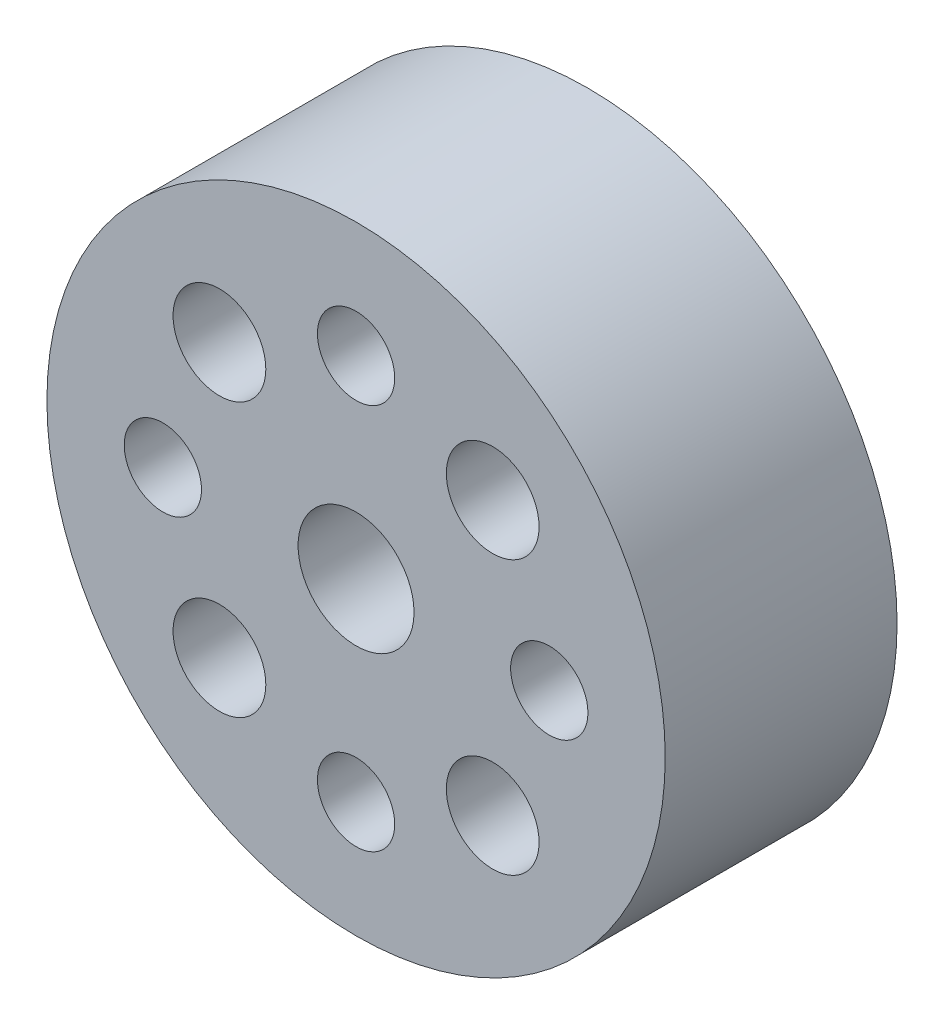
ISO-10303-21;
HEADER;
FILE_DESCRIPTION(('STEP AP214'),'2;1');
FILE_NAME('part.step','',(''),(''),'','','');
FILE_SCHEMA(('AUTOMOTIVE_DESIGN { 1 0 10303 214 1 1 1 1 }'));
ENDSEC;
DATA;
#1=APPLICATION_CONTEXT('core data for automotive mechanical design processes');
#2=APPLICATION_PROTOCOL_DEFINITION('international standard','automotive_design',2000,#1);
#3=PRODUCT_CONTEXT('',#1,'mechanical');
#4=PRODUCT('Part','Part','',(#3));
#5=PRODUCT_RELATED_PRODUCT_CATEGORY('part','',(#4));
#6=PRODUCT_DEFINITION_FORMATION('','',#4);
#7=PRODUCT_DEFINITION_CONTEXT('part definition',#1,'design');
#8=PRODUCT_DEFINITION('design','',#6,#7);
#9=PRODUCT_DEFINITION_SHAPE('','',#8);
#10=(LENGTH_UNIT() NAMED_UNIT(*) SI_UNIT(.MILLI.,.METRE.));
#11=(NAMED_UNIT(*) PLANE_ANGLE_UNIT() SI_UNIT($,.RADIAN.));
#12=(NAMED_UNIT(*) SI_UNIT($,.STERADIAN.) SOLID_ANGLE_UNIT());
#13=UNCERTAINTY_MEASURE_WITH_UNIT(LENGTH_MEASURE(1.E-05),#10,'distance_accuracy_value','');
#14=(GEOMETRIC_REPRESENTATION_CONTEXT(3) GLOBAL_UNCERTAINTY_ASSIGNED_CONTEXT((#13)) GLOBAL_UNIT_ASSIGNED_CONTEXT((#10,
#11,#12)) REPRESENTATION_CONTEXT('',''));
#15=CARTESIAN_POINT('',(0.,0.,0.));
#16=DIRECTION('',(0.,0.,1.));
#17=DIRECTION('',(1.,0.,0.));
#18=AXIS2_PLACEMENT_3D('',#15,#16,#17);
#19=CARTESIAN_POINT('',(0.,0.,30.));
#20=DIRECTION('',(0.,0.,-1.));
#21=DIRECTION('',(-1.,0.,0.));
#22=AXIS2_PLACEMENT_3D('',#19,#20,#21);
#23=CYLINDRICAL_SURFACE('',#22,40.);
#24=CARTESIAN_POINT('',(0.,0.,30.));
#25=DIRECTION('',(0.,0.,1.));
#26=DIRECTION('',(1.,0.,0.));
#27=AXIS2_PLACEMENT_3D('',#24,#25,#26);
#28=CIRCLE('',#27,40.);
#29=CARTESIAN_POINT('',(40.,0.,30.));
#30=VERTEX_POINT('',#29);
#31=EDGE_CURVE('E10',#30,#30,#28,.T.);
#32=ORIENTED_EDGE('',*,*,#31,.F.);
#33=EDGE_LOOP('',(#32));
#34=FACE_BOUND('',#33,.T.);
#35=CARTESIAN_POINT('',(0.,0.,0.));
#36=DIRECTION('',(0.,0.,1.));
#37=DIRECTION('',(1.,0.,0.));
#38=AXIS2_PLACEMENT_3D('',#35,#36,#37);
#39=CIRCLE('',#38,40.);
#40=CARTESIAN_POINT('',(40.,0.,0.));
#41=VERTEX_POINT('',#40);
#42=EDGE_CURVE('E34',#41,#41,#39,.T.);
#43=ORIENTED_EDGE('',*,*,#42,.T.);
#44=EDGE_LOOP('',(#43));
#45=FACE_BOUND('',#44,.T.);
#46=ADVANCED_FACE('F31',(#34,#45),#23,.T.);
#47=CARTESIAN_POINT('',(0.,0.,30.));
#48=DIRECTION('',(0.,0.,1.));
#49=DIRECTION('',(1.,0.,0.));
#50=AXIS2_PLACEMENT_3D('',#47,#48,#49);
#51=PLANE('',#50);
#52=CARTESIAN_POINT('',(0.,0.,30.));
#53=DIRECTION('',(0.,0.,1.));
#54=DIRECTION('',(1.,0.,0.));
#55=AXIS2_PLACEMENT_3D('',#52,#53,#54);
#56=CIRCLE('',#55,7.5);
#57=CARTESIAN_POINT('',(7.5,0.,30.));
#58=VERTEX_POINT('',#57);
#59=EDGE_CURVE('E91',#58,#58,#56,.T.);
#60=ORIENTED_EDGE('',*,*,#59,.F.);
#61=EDGE_LOOP('',(#60));
#62=FACE_BOUND('',#61,.T.);
#63=CARTESIAN_POINT('',(-17.6776695296637,17.6776695296617,30.));
#64=DIRECTION('',(0.,0.,1.));
#65=DIRECTION('',(1.,0.,0.));
#66=AXIS2_PLACEMENT_3D('',#63,#64,#65);
#67=CIRCLE('',#66,6.00000000000201);
#68=CARTESIAN_POINT('',(-11.6776695296617,17.6776695296617,30.));
#69=VERTEX_POINT('',#68);
#70=EDGE_CURVE('E73',#69,#69,#67,.T.);
#71=ORIENTED_EDGE('',*,*,#70,.F.);
#72=EDGE_LOOP('',(#71));
#73=FACE_BOUND('',#72,.T.);
#74=CARTESIAN_POINT('',(-17.6776695296617,-17.6776695296657,30.));
#75=DIRECTION('',(0.,0.,1.));
#76=DIRECTION('',(1.,0.,0.));
#77=AXIS2_PLACEMENT_3D('',#74,#75,#76);
#78=CIRCLE('',#77,6.0000000000014);
#79=CARTESIAN_POINT('',(-11.6776695296603,-17.6776695296657,30.));
#80=VERTEX_POINT('',#79);
#81=EDGE_CURVE('E80',#80,#80,#78,.T.);
#82=ORIENTED_EDGE('',*,*,#81,.F.);
#83=EDGE_LOOP('',(#82));
#84=FACE_BOUND('',#83,.T.);
#85=CARTESIAN_POINT('',(17.6776695296657,-17.6776695296636,30.));
#86=DIRECTION('',(0.,0.,1.));
#87=DIRECTION('',(1.,0.,0.));
#88=AXIS2_PLACEMENT_3D('',#85,#86,#87);
#89=CIRCLE('',#88,5.99999999999947);
#90=CARTESIAN_POINT('',(23.6776695296652,-17.6776695296636,30.));
#91=VERTEX_POINT('',#90);
#92=EDGE_CURVE('E86',#91,#91,#89,.T.);
#93=ORIENTED_EDGE('',*,*,#92,.F.);
#94=EDGE_LOOP('',(#93));
#95=FACE_BOUND('',#94,.T.);
#96=CARTESIAN_POINT('',(17.6776695296637,17.6776695296637,30.));
#97=DIRECTION('',(0.,0.,1.));
#98=DIRECTION('',(1.,0.,0.));
#99=AXIS2_PLACEMENT_3D('',#96,#97,#98);
#100=CIRCLE('',#99,6.);
#101=CARTESIAN_POINT('',(23.6776695296637,17.6776695296637,30.));
#102=VERTEX_POINT('',#101);
#103=EDGE_CURVE('E67',#102,#102,#100,.T.);
#104=ORIENTED_EDGE('',*,*,#103,.F.);
#105=EDGE_LOOP('',(#104));
#106=FACE_BOUND('',#105,.T.);
#107=CARTESIAN_POINT('',(25.,0.,30.));
#108=DIRECTION('',(0.,0.,1.));
#109=DIRECTION('',(1.,0.,0.));
#110=AXIS2_PLACEMENT_3D('',#107,#108,#109);
#111=CIRCLE('',#110,5.);
#112=CARTESIAN_POINT('',(30.,0.,30.));
#113=VERTEX_POINT('',#112);
#114=EDGE_CURVE('E62',#113,#113,#111,.T.);
#115=ORIENTED_EDGE('',*,*,#114,.F.);
#116=EDGE_LOOP('',(#115));
#117=FACE_BOUND('',#116,.T.);
#118=CARTESIAN_POINT('',(0.,-25.,30.));
#119=DIRECTION('',(0.,0.,1.));
#120=DIRECTION('',(1.,0.,0.));
#121=AXIS2_PLACEMENT_3D('',#118,#119,#120);
#122=CIRCLE('',#121,5.);
#123=CARTESIAN_POINT('',(4.99999999999991,-25.,30.));
#124=VERTEX_POINT('',#123);
#125=EDGE_CURVE('E56',#124,#124,#122,.T.);
#126=ORIENTED_EDGE('',*,*,#125,.F.);
#127=EDGE_LOOP('',(#126));
#128=FACE_BOUND('',#127,.T.);
#129=CARTESIAN_POINT('',(-25.,1.74574066942157E-13,30.));
#130=DIRECTION('',(0.,0.,1.));
#131=DIRECTION('',(1.,0.,0.));
#132=AXIS2_PLACEMENT_3D('',#129,#130,#131);
#133=CIRCLE('',#132,5.);
#134=CARTESIAN_POINT('',(-20.,1.74574066942157E-13,30.));
#135=VERTEX_POINT('',#134);
#136=EDGE_CURVE('E50',#135,#135,#133,.T.);
#137=ORIENTED_EDGE('',*,*,#136,.F.);
#138=EDGE_LOOP('',(#137));
#139=FACE_BOUND('',#138,.T.);
#140=CARTESIAN_POINT('',(2.61861100413235E-13,25.,30.));
#141=DIRECTION('',(0.,0.,1.));
#142=DIRECTION('',(1.,0.,0.));
#143=AXIS2_PLACEMENT_3D('',#140,#141,#142);
#144=CIRCLE('',#143,5.);
#145=CARTESIAN_POINT('',(5.00000000000026,25.,30.));
#146=VERTEX_POINT('',#145);
#147=EDGE_CURVE('E43',#146,#146,#144,.T.);
#148=ORIENTED_EDGE('',*,*,#147,.F.);
#149=EDGE_LOOP('',(#148));
#150=FACE_BOUND('',#149,.T.);
#151=ORIENTED_EDGE('',*,*,#31,.T.);
#152=EDGE_LOOP('',(#151));
#153=FACE_BOUND('',#152,.T.);
#154=ADVANCED_FACE('F106',(#62,#73,#84,#95,#106,#117,#128,#139,#150,#153),#51,.T.);
#155=CARTESIAN_POINT('',(0.,0.,0.));
#156=DIRECTION('',(0.,0.,1.));
#157=DIRECTION('',(1.,0.,0.));
#158=AXIS2_PLACEMENT_3D('',#155,#156,#157);
#159=PLANE('',#158);
#160=ORIENTED_EDGE('',*,*,#42,.F.);
#161=EDGE_LOOP('',(#160));
#162=FACE_BOUND('',#161,.T.);
#163=ADVANCED_FACE('F109',(#162),#159,.F.);
#164=CARTESIAN_POINT('',(2.61861100413235E-13,25.,5.));
#165=DIRECTION('',(0.,0.,1.));
#166=DIRECTION('',(1.,0.,0.));
#167=AXIS2_PLACEMENT_3D('',#164,#165,#166);
#168=CYLINDRICAL_SURFACE('',#167,5.);
#169=CARTESIAN_POINT('',(2.61861100413235E-13,25.,5.));
#170=DIRECTION('',(0.,0.,1.));
#171=DIRECTION('',(1.,0.,0.));
#172=AXIS2_PLACEMENT_3D('',#169,#170,#171);
#173=CIRCLE('',#172,5.);
#174=CARTESIAN_POINT('',(5.00000000000026,25.,5.));
#175=VERTEX_POINT('',#174);
#176=EDGE_CURVE('E46',#175,#175,#173,.T.);
#177=ORIENTED_EDGE('',*,*,#176,.F.);
#178=EDGE_LOOP('',(#177));
#179=FACE_BOUND('',#178,.T.);
#180=ORIENTED_EDGE('',*,*,#147,.T.);
#181=EDGE_LOOP('',(#180));
#182=FACE_BOUND('',#181,.T.);
#183=ADVANCED_FACE('F127',(#179,#182),#168,.F.);
#184=CARTESIAN_POINT('',(2.61861100413235E-13,25.,5.));
#185=DIRECTION('',(0.,0.,1.));
#186=DIRECTION('',(1.,0.,0.));
#187=AXIS2_PLACEMENT_3D('',#184,#185,#186);
#188=PLANE('',#187);
#189=ORIENTED_EDGE('',*,*,#176,.T.);
#190=EDGE_LOOP('',(#189));
#191=FACE_BOUND('',#190,.T.);
#192=ADVANCED_FACE('F129',(#191),#188,.T.);
#193=CARTESIAN_POINT('',(-25.,1.74574066942157E-13,5.));
#194=DIRECTION('',(0.,0.,1.));
#195=DIRECTION('',(1.,0.,0.));
#196=AXIS2_PLACEMENT_3D('',#193,#194,#195);
#197=CYLINDRICAL_SURFACE('',#196,5.);
#198=CARTESIAN_POINT('',(-25.,1.74574066942157E-13,5.));
#199=DIRECTION('',(0.,0.,1.));
#200=DIRECTION('',(1.,0.,0.));
#201=AXIS2_PLACEMENT_3D('',#198,#199,#200);
#202=CIRCLE('',#201,5.);
#203=CARTESIAN_POINT('',(-20.,1.74574066942157E-13,5.));
#204=VERTEX_POINT('',#203);
#205=EDGE_CURVE('E53',#204,#204,#202,.T.);
#206=ORIENTED_EDGE('',*,*,#205,.F.);
#207=EDGE_LOOP('',(#206));
#208=FACE_BOUND('',#207,.T.);
#209=ORIENTED_EDGE('',*,*,#136,.T.);
#210=EDGE_LOOP('',(#209));
#211=FACE_BOUND('',#210,.T.);
#212=ADVANCED_FACE('F136',(#208,#211),#197,.F.);
#213=CARTESIAN_POINT('',(-25.,1.74574066942157E-13,5.));
#214=DIRECTION('',(0.,0.,1.));
#215=DIRECTION('',(1.,0.,0.));
#216=AXIS2_PLACEMENT_3D('',#213,#214,#215);
#217=PLANE('',#216);
#218=ORIENTED_EDGE('',*,*,#205,.T.);
#219=EDGE_LOOP('',(#218));
#220=FACE_BOUND('',#219,.T.);
#221=ADVANCED_FACE('F176',(#220),#217,.T.);
#222=CARTESIAN_POINT('',(0.,-25.,5.));
#223=DIRECTION('',(0.,0.,1.));
#224=DIRECTION('',(1.,0.,0.));
#225=AXIS2_PLACEMENT_3D('',#222,#223,#224);
#226=CYLINDRICAL_SURFACE('',#225,5.);
#227=CARTESIAN_POINT('',(0.,-25.,5.));
#228=DIRECTION('',(0.,0.,1.));
#229=DIRECTION('',(1.,0.,0.));
#230=AXIS2_PLACEMENT_3D('',#227,#228,#229);
#231=CIRCLE('',#230,5.);
#232=CARTESIAN_POINT('',(4.99999999999991,-25.,5.));
#233=VERTEX_POINT('',#232);
#234=EDGE_CURVE('E59',#233,#233,#231,.T.);
#235=ORIENTED_EDGE('',*,*,#234,.F.);
#236=EDGE_LOOP('',(#235));
#237=FACE_BOUND('',#236,.T.);
#238=ORIENTED_EDGE('',*,*,#125,.T.);
#239=EDGE_LOOP('',(#238));
#240=FACE_BOUND('',#239,.T.);
#241=ADVANCED_FACE('F186',(#237,#240),#226,.F.);
#242=CARTESIAN_POINT('',(0.,-25.,5.));
#243=DIRECTION('',(0.,0.,1.));
#244=DIRECTION('',(1.,0.,0.));
#245=AXIS2_PLACEMENT_3D('',#242,#243,#244);
#246=PLANE('',#245);
#247=ORIENTED_EDGE('',*,*,#234,.T.);
#248=EDGE_LOOP('',(#247));
#249=FACE_BOUND('',#248,.T.);
#250=ADVANCED_FACE('F196',(#249),#246,.T.);
#251=CARTESIAN_POINT('',(25.,0.,5.));
#252=DIRECTION('',(0.,0.,1.));
#253=DIRECTION('',(1.,0.,0.));
#254=AXIS2_PLACEMENT_3D('',#251,#252,#253);
#255=CYLINDRICAL_SURFACE('',#254,5.);
#256=CARTESIAN_POINT('',(25.,0.,5.));
#257=DIRECTION('',(0.,0.,1.));
#258=DIRECTION('',(1.,0.,0.));
#259=AXIS2_PLACEMENT_3D('',#256,#257,#258);
#260=CIRCLE('',#259,5.);
#261=CARTESIAN_POINT('',(30.,0.,5.));
#262=VERTEX_POINT('',#261);
#263=EDGE_CURVE('E41',#262,#262,#260,.T.);
#264=ORIENTED_EDGE('',*,*,#263,.F.);
#265=EDGE_LOOP('',(#264));
#266=FACE_BOUND('',#265,.T.);
#267=ORIENTED_EDGE('',*,*,#114,.T.);
#268=EDGE_LOOP('',(#267));
#269=FACE_BOUND('',#268,.T.);
#270=ADVANCED_FACE('F206',(#266,#269),#255,.F.);
#271=CARTESIAN_POINT('',(25.,0.,5.));
#272=DIRECTION('',(0.,0.,1.));
#273=DIRECTION('',(1.,0.,0.));
#274=AXIS2_PLACEMENT_3D('',#271,#272,#273);
#275=PLANE('',#274);
#276=ORIENTED_EDGE('',*,*,#263,.T.);
#277=EDGE_LOOP('',(#276));
#278=FACE_BOUND('',#277,.T.);
#279=ADVANCED_FACE('F216',(#278),#275,.T.);
#280=CARTESIAN_POINT('',(17.6776695296637,17.6776695296637,5.));
#281=DIRECTION('',(0.,0.,1.));
#282=DIRECTION('',(1.,0.,0.));
#283=AXIS2_PLACEMENT_3D('',#280,#281,#282);
#284=CYLINDRICAL_SURFACE('',#283,6.);
#285=CARTESIAN_POINT('',(17.6776695296637,17.6776695296637,5.));
#286=DIRECTION('',(0.,0.,1.));
#287=DIRECTION('',(1.,0.,0.));
#288=AXIS2_PLACEMENT_3D('',#285,#286,#287);
#289=CIRCLE('',#288,6.);
#290=CARTESIAN_POINT('',(23.6776695296637,17.6776695296637,5.));
#291=VERTEX_POINT('',#290);
#292=EDGE_CURVE('E47',#291,#291,#289,.T.);
#293=ORIENTED_EDGE('',*,*,#292,.F.);
#294=EDGE_LOOP('',(#293));
#295=FACE_BOUND('',#294,.T.);
#296=ORIENTED_EDGE('',*,*,#103,.T.);
#297=EDGE_LOOP('',(#296));
#298=FACE_BOUND('',#297,.T.);
#299=ADVANCED_FACE('F226',(#295,#298),#284,.F.);
#300=CARTESIAN_POINT('',(17.6776695296637,17.6776695296637,5.));
#301=DIRECTION('',(0.,0.,1.));
#302=DIRECTION('',(1.,0.,0.));
#303=AXIS2_PLACEMENT_3D('',#300,#301,#302);
#304=PLANE('',#303);
#305=ORIENTED_EDGE('',*,*,#292,.T.);
#306=EDGE_LOOP('',(#305));
#307=FACE_BOUND('',#306,.T.);
#308=ADVANCED_FACE('F236',(#307),#304,.T.);
#309=CARTESIAN_POINT('',(17.6776695296657,-17.6776695296636,5.));
#310=DIRECTION('',(0.,0.,1.));
#311=DIRECTION('',(1.,0.,0.));
#312=AXIS2_PLACEMENT_3D('',#309,#310,#311);
#313=CYLINDRICAL_SURFACE('',#312,5.99999999999947);
#314=CARTESIAN_POINT('',(17.6776695296657,-17.6776695296636,5.));
#315=DIRECTION('',(0.,0.,1.));
#316=DIRECTION('',(1.,0.,0.));
#317=AXIS2_PLACEMENT_3D('',#314,#315,#316);
#318=CIRCLE('',#317,5.99999999999947);
#319=CARTESIAN_POINT('',(23.6776695296652,-17.6776695296636,5.));
#320=VERTEX_POINT('',#319);
#321=EDGE_CURVE('E70',#320,#320,#318,.T.);
#322=ORIENTED_EDGE('',*,*,#321,.F.);
#323=EDGE_LOOP('',(#322));
#324=FACE_BOUND('',#323,.T.);
#325=ORIENTED_EDGE('',*,*,#92,.T.);
#326=EDGE_LOOP('',(#325));
#327=FACE_BOUND('',#326,.T.);
#328=ADVANCED_FACE('F246',(#324,#327),#313,.F.);
#329=CARTESIAN_POINT('',(17.6776695296657,-17.6776695296636,5.));
#330=DIRECTION('',(0.,0.,1.));
#331=DIRECTION('',(1.,0.,0.));
#332=AXIS2_PLACEMENT_3D('',#329,#330,#331);
#333=PLANE('',#332);
#334=ORIENTED_EDGE('',*,*,#321,.T.);
#335=EDGE_LOOP('',(#334));
#336=FACE_BOUND('',#335,.T.);
#337=ADVANCED_FACE('F256',(#336),#333,.T.);
#338=CARTESIAN_POINT('',(-17.6776695296617,-17.6776695296657,5.));
#339=DIRECTION('',(0.,0.,1.));
#340=DIRECTION('',(1.,0.,0.));
#341=AXIS2_PLACEMENT_3D('',#338,#339,#340);
#342=CYLINDRICAL_SURFACE('',#341,6.0000000000014);
#343=CARTESIAN_POINT('',(-17.6776695296617,-17.6776695296657,5.));
#344=DIRECTION('',(0.,0.,1.));
#345=DIRECTION('',(1.,0.,0.));
#346=AXIS2_PLACEMENT_3D('',#343,#344,#345);
#347=CIRCLE('',#346,6.0000000000014);
#348=CARTESIAN_POINT('',(-11.6776695296603,-17.6776695296657,5.));
#349=VERTEX_POINT('',#348);
#350=EDGE_CURVE('E83',#349,#349,#347,.T.);
#351=ORIENTED_EDGE('',*,*,#350,.F.);
#352=EDGE_LOOP('',(#351));
#353=FACE_BOUND('',#352,.T.);
#354=ORIENTED_EDGE('',*,*,#81,.T.);
#355=EDGE_LOOP('',(#354));
#356=FACE_BOUND('',#355,.T.);
#357=ADVANCED_FACE('F266',(#353,#356),#342,.F.);
#358=CARTESIAN_POINT('',(-17.6776695296617,-17.6776695296657,5.));
#359=DIRECTION('',(0.,0.,1.));
#360=DIRECTION('',(1.,0.,0.));
#361=AXIS2_PLACEMENT_3D('',#358,#359,#360);
#362=PLANE('',#361);
#363=ORIENTED_EDGE('',*,*,#350,.T.);
#364=EDGE_LOOP('',(#363));
#365=FACE_BOUND('',#364,.T.);
#366=ADVANCED_FACE('F276',(#365),#362,.T.);
#367=CARTESIAN_POINT('',(-17.6776695296637,17.6776695296617,5.));
#368=DIRECTION('',(0.,0.,1.));
#369=DIRECTION('',(1.,0.,0.));
#370=AXIS2_PLACEMENT_3D('',#367,#368,#369);
#371=CYLINDRICAL_SURFACE('',#370,6.00000000000201);
#372=CARTESIAN_POINT('',(-17.6776695296637,17.6776695296617,5.));
#373=DIRECTION('',(0.,0.,1.));
#374=DIRECTION('',(1.,0.,0.));
#375=AXIS2_PLACEMENT_3D('',#372,#373,#374);
#376=CIRCLE('',#375,6.00000000000201);
#377=CARTESIAN_POINT('',(-11.6776695296617,17.6776695296617,5.));
#378=VERTEX_POINT('',#377);
#379=EDGE_CURVE('E76',#378,#378,#376,.T.);
#380=ORIENTED_EDGE('',*,*,#379,.F.);
#381=EDGE_LOOP('',(#380));
#382=FACE_BOUND('',#381,.T.);
#383=ORIENTED_EDGE('',*,*,#70,.T.);
#384=EDGE_LOOP('',(#383));
#385=FACE_BOUND('',#384,.T.);
#386=ADVANCED_FACE('F286',(#382,#385),#371,.F.);
#387=CARTESIAN_POINT('',(-17.6776695296637,17.6776695296617,5.));
#388=DIRECTION('',(0.,0.,1.));
#389=DIRECTION('',(1.,0.,0.));
#390=AXIS2_PLACEMENT_3D('',#387,#388,#389);
#391=PLANE('',#390);
#392=ORIENTED_EDGE('',*,*,#379,.T.);
#393=EDGE_LOOP('',(#392));
#394=FACE_BOUND('',#393,.T.);
#395=ADVANCED_FACE('F102',(#394),#391,.T.);
#396=CARTESIAN_POINT('',(0.,0.,5.));
#397=DIRECTION('',(0.,0.,1.));
#398=DIRECTION('',(1.,0.,0.));
#399=AXIS2_PLACEMENT_3D('',#396,#397,#398);
#400=CYLINDRICAL_SURFACE('',#399,7.5);
#401=CARTESIAN_POINT('',(0.,0.,5.));
#402=DIRECTION('',(0.,0.,1.));
#403=DIRECTION('',(1.,0.,0.));
#404=AXIS2_PLACEMENT_3D('',#401,#402,#403);
#405=CIRCLE('',#404,7.5);
#406=CARTESIAN_POINT('',(7.5,0.,5.));
#407=VERTEX_POINT('',#406);
#408=EDGE_CURVE('E77',#407,#407,#405,.T.);
#409=ORIENTED_EDGE('',*,*,#408,.F.);
#410=EDGE_LOOP('',(#409));
#411=FACE_BOUND('',#410,.T.);
#412=ORIENTED_EDGE('',*,*,#59,.T.);
#413=EDGE_LOOP('',(#412));
#414=FACE_BOUND('',#413,.T.);
#415=ADVANCED_FACE('F99',(#411,#414),#400,.F.);
#416=CARTESIAN_POINT('',(0.,0.,5.));
#417=DIRECTION('',(0.,0.,1.));
#418=DIRECTION('',(1.,0.,0.));
#419=AXIS2_PLACEMENT_3D('',#416,#417,#418);
#420=PLANE('',#419);
#421=ORIENTED_EDGE('',*,*,#408,.T.);
#422=EDGE_LOOP('',(#421));
#423=FACE_BOUND('',#422,.T.);
#424=ADVANCED_FACE('F97',(#423),#420,.T.);
#425=CLOSED_SHELL('',(#46,#154,#163,#183,#192,#212,#221,#241,#250,#270,#279,#299,#308,#328,#337,
#357,#366,#386,#395,#415,#424));
#426=MANIFOLD_SOLID_BREP('B2',#425);
#427=ADVANCED_BREP_SHAPE_REPRESENTATION('',(#18,#426),#14);
#428=SHAPE_DEFINITION_REPRESENTATION(#9,#427);
ENDSEC;
END-ISO-10303-21;
